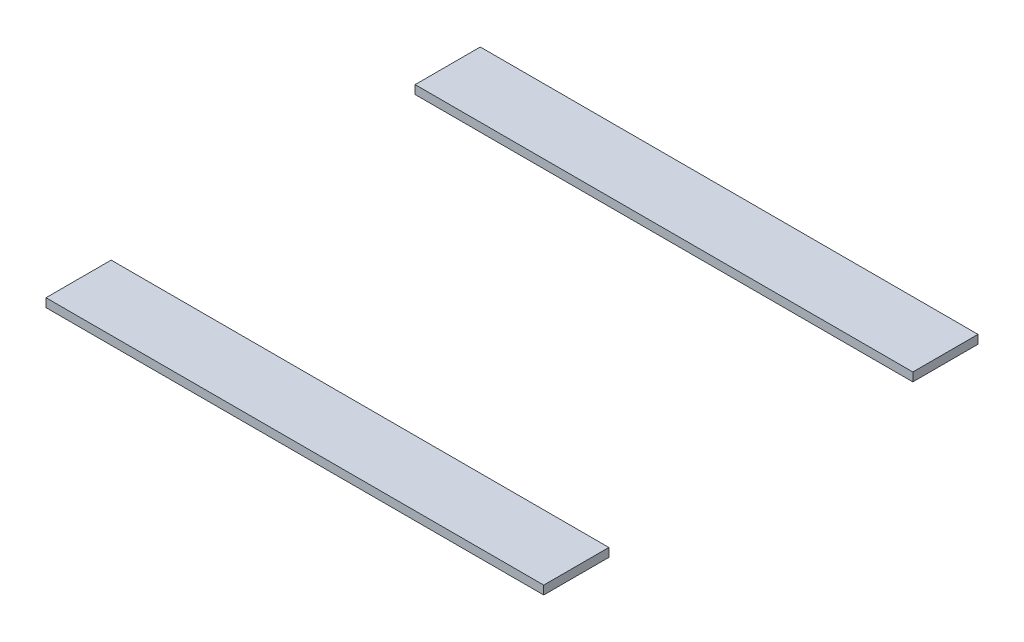
ISO-10303-21;
HEADER;
FILE_DESCRIPTION(('STEP AP214'),'2;1');
FILE_NAME('part.step','',(''),(''),'','','');
FILE_SCHEMA(('AUTOMOTIVE_DESIGN { 1 0 10303 214 1 1 1 1 }'));
ENDSEC;
DATA;
#1=APPLICATION_CONTEXT('core data for automotive mechanical design processes');
#2=APPLICATION_PROTOCOL_DEFINITION('international standard','automotive_design',2000,#1);
#3=PRODUCT_CONTEXT('',#1,'mechanical');
#4=PRODUCT('Part','Part','',(#3));
#5=PRODUCT_RELATED_PRODUCT_CATEGORY('part','',(#4));
#6=PRODUCT_DEFINITION_FORMATION('','',#4);
#7=PRODUCT_DEFINITION_CONTEXT('part definition',#1,'design');
#8=PRODUCT_DEFINITION('design','',#6,#7);
#9=PRODUCT_DEFINITION_SHAPE('','',#8);
#10=(LENGTH_UNIT() NAMED_UNIT(*) SI_UNIT(.MILLI.,.METRE.));
#11=(NAMED_UNIT(*) PLANE_ANGLE_UNIT() SI_UNIT($,.RADIAN.));
#12=(NAMED_UNIT(*) SI_UNIT($,.STERADIAN.) SOLID_ANGLE_UNIT());
#13=UNCERTAINTY_MEASURE_WITH_UNIT(LENGTH_MEASURE(1.E-05),#10,'distance_accuracy_value','');
#14=(GEOMETRIC_REPRESENTATION_CONTEXT(3) GLOBAL_UNCERTAINTY_ASSIGNED_CONTEXT((#13)) GLOBAL_UNIT_ASSIGNED_CONTEXT((#10,
#11,#12)) REPRESENTATION_CONTEXT('',''));
#15=CARTESIAN_POINT('',(0.,0.,0.));
#16=DIRECTION('',(0.,0.,1.));
#17=DIRECTION('',(1.,0.,0.));
#18=AXIS2_PLACEMENT_3D('',#15,#16,#17);
#19=CARTESIAN_POINT('',(104.2,-3.19999999999999,80.6395610261527));
#20=DIRECTION('',(1.,0.,0.));
#21=DIRECTION('',(0.,0.,-1.));
#22=AXIS2_PLACEMENT_3D('',#19,#20,#21);
#23=PLANE('',#22);
#24=DIRECTION('',(0.,0.,-1.));
#25=VECTOR('',#24,1.);
#26=CARTESIAN_POINT('',(104.2,0.,80.6395610261527));
#27=LINE('',#26,#25);
#28=CARTESIAN_POINT('',(104.2,0.,80.6395610261527));
#29=VERTEX_POINT('',#28);
#30=CARTESIAN_POINT('',(104.2,0.,56.4395610261526));
#31=VERTEX_POINT('',#30);
#32=EDGE_CURVE('E107',#29,#31,#27,.T.);
#33=ORIENTED_EDGE('',*,*,#32,.F.);
#34=DIRECTION('',(0.,1.,0.));
#35=VECTOR('',#34,1.);
#36=CARTESIAN_POINT('',(104.2,-3.19999999999999,80.6395610261527));
#37=LINE('',#36,#35);
#38=CARTESIAN_POINT('',(104.2,-3.19999999999999,80.6395610261527));
#39=VERTEX_POINT('',#38);
#40=EDGE_CURVE('E12',#39,#29,#37,.T.);
#41=ORIENTED_EDGE('',*,*,#40,.F.);
#42=DIRECTION('',(0.,0.,-1.));
#43=VECTOR('',#42,1.);
#44=CARTESIAN_POINT('',(104.2,-3.19999999999999,80.6395610261527));
#45=LINE('',#44,#43);
#46=CARTESIAN_POINT('',(104.2,-3.19999999999999,56.4395610261526));
#47=VERTEX_POINT('',#46);
#48=EDGE_CURVE('E101',#39,#47,#45,.T.);
#49=ORIENTED_EDGE('',*,*,#48,.T.);
#50=DIRECTION('',(0.,1.,0.));
#51=VECTOR('',#50,1.);
#52=CARTESIAN_POINT('',(104.2,-3.19999999999999,56.4395610261526));
#53=LINE('',#52,#51);
#54=EDGE_CURVE('E46',#47,#31,#53,.T.);
#55=ORIENTED_EDGE('',*,*,#54,.T.);
#56=EDGE_LOOP('',(#33,#41,#49,#55));
#57=FACE_BOUND('',#56,.T.);
#58=ADVANCED_FACE('F43',(#57),#23,.T.);
#59=CARTESIAN_POINT('',(-80.6395610261527,-3.19999999999999,80.6395610261527));
#60=DIRECTION('',(0.,0.,1.));
#61=DIRECTION('',(1.,0.,0.));
#62=AXIS2_PLACEMENT_3D('',#59,#60,#61);
#63=PLANE('',#62);
#64=DIRECTION('',(1.,0.,0.));
#65=VECTOR('',#64,1.);
#66=CARTESIAN_POINT('',(-80.6395610261527,0.,80.6395610261527));
#67=LINE('',#66,#65);
#68=CARTESIAN_POINT('',(-80.6395610261527,0.,80.6395610261527));
#69=VERTEX_POINT('',#68);
#70=EDGE_CURVE('E103',#69,#29,#67,.T.);
#71=ORIENTED_EDGE('',*,*,#70,.F.);
#72=DIRECTION('',(0.,1.,0.));
#73=VECTOR('',#72,1.);
#74=CARTESIAN_POINT('',(-80.6395610261527,-3.19999999999999,80.6395610261527));
#75=LINE('',#74,#73);
#76=CARTESIAN_POINT('',(-80.6395610261527,-3.19999999999999,80.6395610261527));
#77=VERTEX_POINT('',#76);
#78=EDGE_CURVE('E52',#77,#69,#75,.T.);
#79=ORIENTED_EDGE('',*,*,#78,.F.);
#80=DIRECTION('',(1.,0.,0.));
#81=VECTOR('',#80,1.);
#82=CARTESIAN_POINT('',(-80.6395610261527,-3.19999999999999,80.6395610261527));
#83=LINE('',#82,#81);
#84=EDGE_CURVE('E98',#77,#39,#83,.T.);
#85=ORIENTED_EDGE('',*,*,#84,.T.);
#86=ORIENTED_EDGE('',*,*,#40,.T.);
#87=EDGE_LOOP('',(#71,#79,#85,#86));
#88=FACE_BOUND('',#87,.T.);
#89=ADVANCED_FACE('F117',(#88),#63,.T.);
#90=CARTESIAN_POINT('',(-80.6395610261527,-3.19999999999999,56.4395610261526));
#91=DIRECTION('',(-1.,0.,0.));
#92=DIRECTION('',(0.,0.,1.));
#93=AXIS2_PLACEMENT_3D('',#90,#91,#92);
#94=PLANE('',#93);
#95=DIRECTION('',(0.,0.,1.));
#96=VECTOR('',#95,1.);
#97=CARTESIAN_POINT('',(-80.6395610261527,0.,56.4395610261526));
#98=LINE('',#97,#96);
#99=CARTESIAN_POINT('',(-80.6395610261527,0.,56.4395610261526));
#100=VERTEX_POINT('',#99);
#101=EDGE_CURVE('E93',#100,#69,#98,.T.);
#102=ORIENTED_EDGE('',*,*,#101,.F.);
#103=DIRECTION('',(0.,1.,0.));
#104=VECTOR('',#103,1.);
#105=CARTESIAN_POINT('',(-80.6395610261527,-3.19999999999999,56.4395610261526));
#106=LINE('',#105,#104);
#107=CARTESIAN_POINT('',(-80.6395610261527,-3.19999999999999,56.4395610261526));
#108=VERTEX_POINT('',#107);
#109=EDGE_CURVE('E88',#108,#100,#106,.T.);
#110=ORIENTED_EDGE('',*,*,#109,.F.);
#111=DIRECTION('',(0.,0.,1.));
#112=VECTOR('',#111,1.);
#113=CARTESIAN_POINT('',(-80.6395610261527,-3.19999999999999,56.4395610261526));
#114=LINE('',#113,#112);
#115=EDGE_CURVE('E91',#108,#77,#114,.T.);
#116=ORIENTED_EDGE('',*,*,#115,.T.);
#117=ORIENTED_EDGE('',*,*,#78,.T.);
#118=EDGE_LOOP('',(#102,#110,#116,#117));
#119=FACE_BOUND('',#118,.T.);
#120=ADVANCED_FACE('F90',(#119),#94,.T.);
#121=CARTESIAN_POINT('',(-80.6395610261527,-3.19999999999999,56.4395610261526));
#122=DIRECTION('',(0.,0.,-1.));
#123=DIRECTION('',(-1.,0.,0.));
#124=AXIS2_PLACEMENT_3D('',#121,#122,#123);
#125=PLANE('',#124);
#126=DIRECTION('',(-1.,0.,0.));
#127=VECTOR('',#126,1.);
#128=CARTESIAN_POINT('',(-80.6395610261527,0.,56.4395610261526));
#129=LINE('',#128,#127);
#130=EDGE_CURVE('E110',#31,#100,#129,.T.);
#131=ORIENTED_EDGE('',*,*,#130,.F.);
#132=ORIENTED_EDGE('',*,*,#54,.F.);
#133=DIRECTION('',(-1.,0.,0.));
#134=VECTOR('',#133,1.);
#135=CARTESIAN_POINT('',(-80.6395610261527,-3.19999999999999,56.4395610261526));
#136=LINE('',#135,#134);
#137=EDGE_CURVE('E97',#47,#108,#136,.T.);
#138=ORIENTED_EDGE('',*,*,#137,.T.);
#139=ORIENTED_EDGE('',*,*,#109,.T.);
#140=EDGE_LOOP('',(#131,#132,#138,#139));
#141=FACE_BOUND('',#140,.T.);
#142=ADVANCED_FACE('F100',(#141),#125,.T.);
#143=CARTESIAN_POINT('',(0.,-3.19999999999999,0.));
#144=DIRECTION('',(0.,-1.,0.));
#145=DIRECTION('',(0.,0.,-1.));
#146=AXIS2_PLACEMENT_3D('',#143,#144,#145);
#147=PLANE('',#146);
#148=ORIENTED_EDGE('',*,*,#48,.F.);
#149=ORIENTED_EDGE('',*,*,#84,.F.);
#150=ORIENTED_EDGE('',*,*,#115,.F.);
#151=ORIENTED_EDGE('',*,*,#137,.F.);
#152=EDGE_LOOP('',(#148,#149,#150,#151));
#153=FACE_BOUND('',#152,.T.);
#154=ADVANCED_FACE('F96',(#153),#147,.T.);
#155=CARTESIAN_POINT('',(0.,0.,0.));
#156=DIRECTION('',(0.,-1.,0.));
#157=DIRECTION('',(0.,0.,-1.));
#158=AXIS2_PLACEMENT_3D('',#155,#156,#157);
#159=PLANE('',#158);
#160=ORIENTED_EDGE('',*,*,#32,.T.);
#161=ORIENTED_EDGE('',*,*,#130,.T.);
#162=ORIENTED_EDGE('',*,*,#101,.T.);
#163=ORIENTED_EDGE('',*,*,#70,.T.);
#164=EDGE_LOOP('',(#160,#161,#162,#163));
#165=FACE_BOUND('',#164,.T.);
#166=ADVANCED_FACE('F116',(#165),#159,.F.);
#167=CLOSED_SHELL('',(#58,#89,#120,#142,#154,#166));
#168=MANIFOLD_SOLID_BREP('B2',#167);
#169=CARTESIAN_POINT('',(-80.6395610261527,-3.19999999999999,-56.4395610261526));
#170=DIRECTION('',(-1.,0.,0.));
#171=DIRECTION('',(0.,0.,1.));
#172=AXIS2_PLACEMENT_3D('',#169,#170,#171);
#173=PLANE('',#172);
#174=DIRECTION('',(0.,0.,1.));
#175=VECTOR('',#174,1.);
#176=CARTESIAN_POINT('',(-80.6395610261527,0.,-56.4395610261526));
#177=LINE('',#176,#175);
#178=CARTESIAN_POINT('',(-80.6395610261527,0.,-80.6395610261527));
#179=VERTEX_POINT('',#178);
#180=CARTESIAN_POINT('',(-80.6395610261527,0.,-56.4395610261526));
#181=VERTEX_POINT('',#180);
#182=EDGE_CURVE('E231',#179,#181,#177,.T.);
#183=ORIENTED_EDGE('',*,*,#182,.F.);
#184=DIRECTION('',(0.,1.,0.));
#185=VECTOR('',#184,1.);
#186=CARTESIAN_POINT('',(-80.6395610261527,-3.19999999999999,-80.6395610261527));
#187=LINE('',#186,#185);
#188=CARTESIAN_POINT('',(-80.6395610261527,-3.19999999999999,-80.6395610261527));
#189=VERTEX_POINT('',#188);
#190=EDGE_CURVE('E41',#189,#179,#187,.T.);
#191=ORIENTED_EDGE('',*,*,#190,.F.);
#192=DIRECTION('',(0.,0.,1.));
#193=VECTOR('',#192,1.);
#194=CARTESIAN_POINT('',(-80.6395610261527,-3.19999999999999,-56.4395610261526));
#195=LINE('',#194,#193);
#196=CARTESIAN_POINT('',(-80.6395610261527,-3.19999999999999,-56.4395610261526));
#197=VERTEX_POINT('',#196);
#198=EDGE_CURVE('E225',#189,#197,#195,.T.);
#199=ORIENTED_EDGE('',*,*,#198,.T.);
#200=DIRECTION('',(0.,1.,0.));
#201=VECTOR('',#200,1.);
#202=CARTESIAN_POINT('',(-80.6395610261527,-3.19999999999999,-56.4395610261526));
#203=LINE('',#202,#201);
#204=EDGE_CURVE('E170',#197,#181,#203,.T.);
#205=ORIENTED_EDGE('',*,*,#204,.T.);
#206=EDGE_LOOP('',(#183,#191,#199,#205));
#207=FACE_BOUND('',#206,.T.);
#208=ADVANCED_FACE('F167',(#207),#173,.T.);
#209=CARTESIAN_POINT('',(-80.6395610261527,-3.19999999999999,-80.6395610261527));
#210=DIRECTION('',(0.,0.,-1.));
#211=DIRECTION('',(-1.,0.,0.));
#212=AXIS2_PLACEMENT_3D('',#209,#210,#211);
#213=PLANE('',#212);
#214=DIRECTION('',(-1.,0.,0.));
#215=VECTOR('',#214,1.);
#216=CARTESIAN_POINT('',(-80.6395610261527,0.,-80.6395610261527));
#217=LINE('',#216,#215);
#218=CARTESIAN_POINT('',(104.2,0.,-80.6395610261527));
#219=VERTEX_POINT('',#218);
#220=EDGE_CURVE('E227',#219,#179,#217,.T.);
#221=ORIENTED_EDGE('',*,*,#220,.F.);
#222=DIRECTION('',(0.,1.,0.));
#223=VECTOR('',#222,1.);
#224=CARTESIAN_POINT('',(104.2,-3.19999999999999,-80.6395610261527));
#225=LINE('',#224,#223);
#226=CARTESIAN_POINT('',(104.2,-3.19999999999999,-80.6395610261527));
#227=VERTEX_POINT('',#226);
#228=EDGE_CURVE('E176',#227,#219,#225,.T.);
#229=ORIENTED_EDGE('',*,*,#228,.F.);
#230=DIRECTION('',(-1.,0.,0.));
#231=VECTOR('',#230,1.);
#232=CARTESIAN_POINT('',(-80.6395610261527,-3.19999999999999,-80.6395610261527));
#233=LINE('',#232,#231);
#234=EDGE_CURVE('E222',#227,#189,#233,.T.);
#235=ORIENTED_EDGE('',*,*,#234,.T.);
#236=ORIENTED_EDGE('',*,*,#190,.T.);
#237=EDGE_LOOP('',(#221,#229,#235,#236));
#238=FACE_BOUND('',#237,.T.);
#239=ADVANCED_FACE('F241',(#238),#213,.T.);
#240=CARTESIAN_POINT('',(104.2,-3.19999999999999,-80.6395610261527));
#241=DIRECTION('',(1.,0.,0.));
#242=DIRECTION('',(0.,0.,-1.));
#243=AXIS2_PLACEMENT_3D('',#240,#241,#242);
#244=PLANE('',#243);
#245=DIRECTION('',(0.,0.,-1.));
#246=VECTOR('',#245,1.);
#247=CARTESIAN_POINT('',(104.2,0.,-80.6395610261527));
#248=LINE('',#247,#246);
#249=CARTESIAN_POINT('',(104.2,0.,-56.4395610261526));
#250=VERTEX_POINT('',#249);
#251=EDGE_CURVE('E217',#250,#219,#248,.T.);
#252=ORIENTED_EDGE('',*,*,#251,.F.);
#253=DIRECTION('',(0.,1.,0.));
#254=VECTOR('',#253,1.);
#255=CARTESIAN_POINT('',(104.2,-3.19999999999999,-56.4395610261526));
#256=LINE('',#255,#254);
#257=CARTESIAN_POINT('',(104.2,-3.19999999999999,-56.4395610261526));
#258=VERTEX_POINT('',#257);
#259=EDGE_CURVE('E212',#258,#250,#256,.T.);
#260=ORIENTED_EDGE('',*,*,#259,.F.);
#261=DIRECTION('',(0.,0.,-1.));
#262=VECTOR('',#261,1.);
#263=CARTESIAN_POINT('',(104.2,-3.19999999999999,-80.6395610261527));
#264=LINE('',#263,#262);
#265=EDGE_CURVE('E215',#258,#227,#264,.T.);
#266=ORIENTED_EDGE('',*,*,#265,.T.);
#267=ORIENTED_EDGE('',*,*,#228,.T.);
#268=EDGE_LOOP('',(#252,#260,#266,#267));
#269=FACE_BOUND('',#268,.T.);
#270=ADVANCED_FACE('F214',(#269),#244,.T.);
#271=CARTESIAN_POINT('',(104.2,-3.19999999999999,-56.4395610261526));
#272=DIRECTION('',(0.,0.,1.));
#273=DIRECTION('',(1.,0.,0.));
#274=AXIS2_PLACEMENT_3D('',#271,#272,#273);
#275=PLANE('',#274);
#276=DIRECTION('',(1.,0.,0.));
#277=VECTOR('',#276,1.);
#278=CARTESIAN_POINT('',(104.2,0.,-56.4395610261526));
#279=LINE('',#278,#277);
#280=EDGE_CURVE('E234',#181,#250,#279,.T.);
#281=ORIENTED_EDGE('',*,*,#280,.F.);
#282=ORIENTED_EDGE('',*,*,#204,.F.);
#283=DIRECTION('',(1.,0.,0.));
#284=VECTOR('',#283,1.);
#285=CARTESIAN_POINT('',(104.2,-3.19999999999999,-56.4395610261526));
#286=LINE('',#285,#284);
#287=EDGE_CURVE('E221',#197,#258,#286,.T.);
#288=ORIENTED_EDGE('',*,*,#287,.T.);
#289=ORIENTED_EDGE('',*,*,#259,.T.);
#290=EDGE_LOOP('',(#281,#282,#288,#289));
#291=FACE_BOUND('',#290,.T.);
#292=ADVANCED_FACE('F224',(#291),#275,.T.);
#293=CARTESIAN_POINT('',(0.,-3.19999999999999,0.));
#294=DIRECTION('',(0.,-1.,0.));
#295=DIRECTION('',(0.,0.,-1.));
#296=AXIS2_PLACEMENT_3D('',#293,#294,#295);
#297=PLANE('',#296);
#298=ORIENTED_EDGE('',*,*,#198,.F.);
#299=ORIENTED_EDGE('',*,*,#234,.F.);
#300=ORIENTED_EDGE('',*,*,#265,.F.);
#301=ORIENTED_EDGE('',*,*,#287,.F.);
#302=EDGE_LOOP('',(#298,#299,#300,#301));
#303=FACE_BOUND('',#302,.T.);
#304=ADVANCED_FACE('F220',(#303),#297,.T.);
#305=CARTESIAN_POINT('',(0.,0.,0.));
#306=DIRECTION('',(0.,-1.,0.));
#307=DIRECTION('',(0.,0.,-1.));
#308=AXIS2_PLACEMENT_3D('',#305,#306,#307);
#309=PLANE('',#308);
#310=ORIENTED_EDGE('',*,*,#182,.T.);
#311=ORIENTED_EDGE('',*,*,#280,.T.);
#312=ORIENTED_EDGE('',*,*,#251,.T.);
#313=ORIENTED_EDGE('',*,*,#220,.T.);
#314=EDGE_LOOP('',(#310,#311,#312,#313));
#315=FACE_BOUND('',#314,.T.);
#316=ADVANCED_FACE('F240',(#315),#309,.F.);
#317=CLOSED_SHELL('',(#208,#239,#270,#292,#304,#316));
#318=MANIFOLD_SOLID_BREP('B6',#317);
#319=ADVANCED_BREP_SHAPE_REPRESENTATION('',(#18,#168,#318),#14);
#320=SHAPE_DEFINITION_REPRESENTATION(#9,#319);
ENDSEC;
END-ISO-10303-21;
